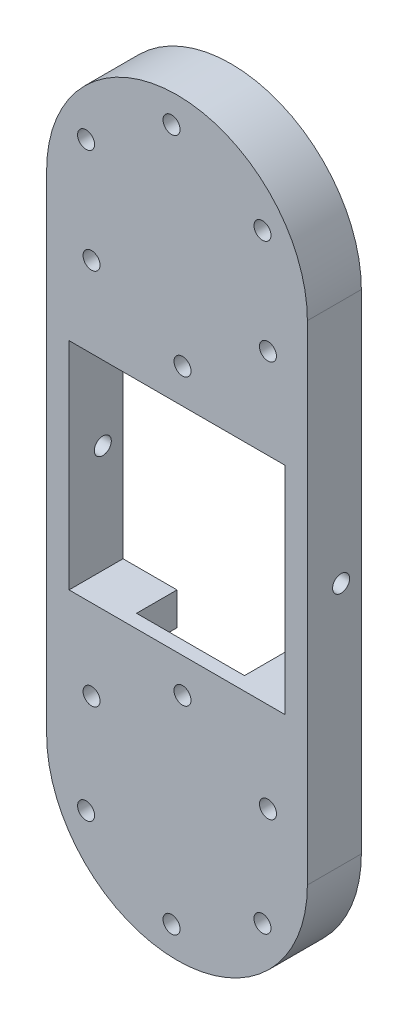
ISO-10303-21;
HEADER;
FILE_DESCRIPTION(('STEP AP214'),'2;1');
FILE_NAME('part.step','',(''),(''),'','','');
FILE_SCHEMA(('AUTOMOTIVE_DESIGN { 1 0 10303 214 1 1 1 1 }'));
ENDSEC;
DATA;
#1=APPLICATION_CONTEXT('core data for automotive mechanical design processes');
#2=APPLICATION_PROTOCOL_DEFINITION('international standard','automotive_design',2000,#1);
#3=PRODUCT_CONTEXT('',#1,'mechanical');
#4=PRODUCT('Part','Part','',(#3));
#5=PRODUCT_RELATED_PRODUCT_CATEGORY('part','',(#4));
#6=PRODUCT_DEFINITION_FORMATION('','',#4);
#7=PRODUCT_DEFINITION_CONTEXT('part definition',#1,'design');
#8=PRODUCT_DEFINITION('design','',#6,#7);
#9=PRODUCT_DEFINITION_SHAPE('','',#8);
#10=(LENGTH_UNIT() NAMED_UNIT(*) SI_UNIT(.MILLI.,.METRE.));
#11=(NAMED_UNIT(*) PLANE_ANGLE_UNIT() SI_UNIT($,.RADIAN.));
#12=(NAMED_UNIT(*) SI_UNIT($,.STERADIAN.) SOLID_ANGLE_UNIT());
#13=UNCERTAINTY_MEASURE_WITH_UNIT(LENGTH_MEASURE(1.E-05),#10,'distance_accuracy_value','');
#14=(GEOMETRIC_REPRESENTATION_CONTEXT(3) GLOBAL_UNCERTAINTY_ASSIGNED_CONTEXT((#13)) GLOBAL_UNIT_ASSIGNED_CONTEXT((#10,
#11,#12)) REPRESENTATION_CONTEXT('',''));
#15=CARTESIAN_POINT('',(0.,0.,0.));
#16=DIRECTION('',(0.,0.,1.));
#17=DIRECTION('',(1.,0.,0.));
#18=AXIS2_PLACEMENT_3D('',#15,#16,#17);
#19=CARTESIAN_POINT('',(0.,57.5,12.7));
#20=DIRECTION('',(0.,0.,-1.));
#21=DIRECTION('',(-1.,0.,0.));
#22=AXIS2_PLACEMENT_3D('',#19,#20,#21);
#23=CYLINDRICAL_SURFACE('',#22,27.5);
#24=DIRECTION('',(0.,0.,-1.));
#25=VECTOR('',#24,1.);
#26=CARTESIAN_POINT('',(12.7,33.1081980985414,12.7));
#27=LINE('',#26,#25);
#28=CARTESIAN_POINT('',(12.7,33.1081980985414,9.52500000000001));
#29=VERTEX_POINT('',#28);
#30=CARTESIAN_POINT('',(12.7,33.1081980985414,0.));
#31=VERTEX_POINT('',#30);
#32=EDGE_CURVE('E569',#29,#31,#27,.T.);
#33=ORIENTED_EDGE('',*,*,#32,.F.);
#34=CARTESIAN_POINT('',(0.,57.5,9.525));
#35=DIRECTION('',(0.,0.,1.));
#36=DIRECTION('',(1.,0.,0.));
#37=AXIS2_PLACEMENT_3D('',#34,#35,#36);
#38=CIRCLE('',#37,27.5);
#39=CARTESIAN_POINT('',(-12.7,33.1081980985414,9.52500000000001));
#40=VERTEX_POINT('',#39);
#41=EDGE_CURVE('E185',#29,#40,#38,.T.);
#42=ORIENTED_EDGE('',*,*,#41,.T.);
#43=DIRECTION('',(0.,0.,-1.));
#44=VECTOR('',#43,1.);
#45=CARTESIAN_POINT('',(-12.7,33.1081980985414,12.7));
#46=LINE('',#45,#44);
#47=CARTESIAN_POINT('',(-12.7,33.1081980985414,0.));
#48=VERTEX_POINT('',#47);
#49=EDGE_CURVE('E177',#48,#40,#46,.F.);
#50=ORIENTED_EDGE('',*,*,#49,.F.);
#51=CARTESIAN_POINT('',(0.,57.5,0.));
#52=DIRECTION('',(0.,0.,1.));
#53=DIRECTION('',(-1.,0.,0.));
#54=AXIS2_PLACEMENT_3D('',#51,#52,#53);
#55=CIRCLE('',#54,27.5);
#56=EDGE_CURVE('E244',#31,#48,#55,.T.);
#57=ORIENTED_EDGE('',*,*,#56,.F.);
#58=EDGE_LOOP('',(#33,#42,#50,#57));
#59=FACE_BOUND('',#58,.T.);
#60=ADVANCED_FACE('F45',(#59),#23,.F.);
#61=CARTESIAN_POINT('',(0.,-57.5,12.7));
#62=DIRECTION('',(0.,0.,-1.));
#63=DIRECTION('',(-1.,0.,0.));
#64=AXIS2_PLACEMENT_3D('',#61,#62,#63);
#65=CYLINDRICAL_SURFACE('',#64,27.5);
#66=DIRECTION('',(0.,0.,-1.));
#67=VECTOR('',#66,1.);
#68=CARTESIAN_POINT('',(12.7,-33.1081980985414,12.7));
#69=LINE('',#68,#67);
#70=CARTESIAN_POINT('',(12.7,-33.1081980985414,0.));
#71=VERTEX_POINT('',#70);
#72=CARTESIAN_POINT('',(12.7,-33.1081980985414,9.52500000000001));
#73=VERTEX_POINT('',#72);
#74=EDGE_CURVE('E564',#71,#73,#69,.F.);
#75=ORIENTED_EDGE('',*,*,#74,.F.);
#76=CARTESIAN_POINT('',(0.,-57.5,0.));
#77=DIRECTION('',(0.,0.,1.));
#78=DIRECTION('',(1.,0.,0.));
#79=AXIS2_PLACEMENT_3D('',#76,#77,#78);
#80=CIRCLE('',#79,27.5);
#81=CARTESIAN_POINT('',(-12.7,-33.1081980985414,0.));
#82=VERTEX_POINT('',#81);
#83=EDGE_CURVE('E175',#82,#71,#80,.T.);
#84=ORIENTED_EDGE('',*,*,#83,.F.);
#85=DIRECTION('',(0.,0.,-1.));
#86=VECTOR('',#85,1.);
#87=CARTESIAN_POINT('',(-12.7,-33.1081980985414,12.7));
#88=LINE('',#87,#86);
#89=CARTESIAN_POINT('',(-12.7,-33.1081980985414,9.52500000000001));
#90=VERTEX_POINT('',#89);
#91=EDGE_CURVE('E160',#90,#82,#88,.T.);
#92=ORIENTED_EDGE('',*,*,#91,.F.);
#93=CARTESIAN_POINT('',(0.,-57.5,9.525));
#94=DIRECTION('',(0.,0.,1.));
#95=DIRECTION('',(1.,0.,0.));
#96=AXIS2_PLACEMENT_3D('',#93,#94,#95);
#97=CIRCLE('',#96,27.5);
#98=EDGE_CURVE('E173',#90,#73,#97,.T.);
#99=ORIENTED_EDGE('',*,*,#98,.T.);
#100=EDGE_LOOP('',(#75,#84,#92,#99));
#101=FACE_BOUND('',#100,.T.);
#102=ADVANCED_FACE('F172',(#101),#65,.F.);
#103=CARTESIAN_POINT('',(0.,-57.5,12.7));
#104=DIRECTION('',(0.,0.,-1.));
#105=DIRECTION('',(-1.,0.,0.));
#106=AXIS2_PLACEMENT_3D('',#103,#104,#105);
#107=PLANE('',#106);
#108=CARTESIAN_POINT('',(0.,-57.5,12.7));
#109=DIRECTION('',(0.,0.,1.));
#110=DIRECTION('',(-1.,0.,0.));
#111=AXIS2_PLACEMENT_3D('',#108,#109,#110);
#112=CIRCLE('',#111,30.6750002325888);
#113=CARTESIAN_POINT('',(-30.6750002325888,-57.5,12.7));
#114=VERTEX_POINT('',#113);
#115=CARTESIAN_POINT('',(30.6750002325889,-57.5,12.7));
#116=VERTEX_POINT('',#115);
#117=EDGE_CURVE('E249',#114,#116,#112,.T.);
#118=ORIENTED_EDGE('',*,*,#117,.T.);
#119=DIRECTION('',(0.,1.,0.));
#120=VECTOR('',#119,1.);
#121=CARTESIAN_POINT('',(30.6750002325889,57.5,12.7));
#122=LINE('',#121,#120);
#123=CARTESIAN_POINT('',(30.6750002325889,57.5,12.7));
#124=VERTEX_POINT('',#123);
#125=EDGE_CURVE('E253',#116,#124,#122,.T.);
#126=ORIENTED_EDGE('',*,*,#125,.T.);
#127=CARTESIAN_POINT('',(0.,57.5,12.7));
#128=DIRECTION('',(0.,0.,1.));
#129=DIRECTION('',(1.,0.,0.));
#130=AXIS2_PLACEMENT_3D('',#127,#128,#129);
#131=CIRCLE('',#130,30.6750002325888);
#132=CARTESIAN_POINT('',(-30.6750002325888,57.5,12.7));
#133=VERTEX_POINT('',#132);
#134=EDGE_CURVE('E257',#124,#133,#131,.T.);
#135=ORIENTED_EDGE('',*,*,#134,.T.);
#136=DIRECTION('',(0.,-1.,0.));
#137=VECTOR('',#136,1.);
#138=CARTESIAN_POINT('',(-30.6750002325888,-57.5,12.7));
#139=LINE('',#138,#137);
#140=EDGE_CURVE('E260',#133,#114,#139,.T.);
#141=ORIENTED_EDGE('',*,*,#140,.T.);
#142=EDGE_LOOP('',(#118,#126,#135,#141));
#143=FACE_BOUND('',#142,.T.);
#144=DIRECTION('',(0.,-1.,0.));
#145=VECTOR('',#144,1.);
#146=CARTESIAN_POINT('',(-25.4,-25.4,12.7));
#147=LINE('',#146,#145);
#148=CARTESIAN_POINT('',(-25.4,25.4,12.7));
#149=VERTEX_POINT('',#148);
#150=CARTESIAN_POINT('',(-25.4,-25.4,12.7));
#151=VERTEX_POINT('',#150);
#152=EDGE_CURVE('E198',#149,#151,#147,.T.);
#153=ORIENTED_EDGE('',*,*,#152,.F.);
#154=DIRECTION('',(-1.,0.,0.));
#155=VECTOR('',#154,1.);
#156=CARTESIAN_POINT('',(25.4,25.4,12.7));
#157=LINE('',#156,#155);
#158=CARTESIAN_POINT('',(25.4,25.4,12.7));
#159=VERTEX_POINT('',#158);
#160=EDGE_CURVE('E209',#159,#149,#157,.T.);
#161=ORIENTED_EDGE('',*,*,#160,.F.);
#162=DIRECTION('',(0.,1.,0.));
#163=VECTOR('',#162,1.);
#164=CARTESIAN_POINT('',(25.4,-25.4,12.7));
#165=LINE('',#164,#163);
#166=CARTESIAN_POINT('',(25.4,-25.4,12.7));
#167=VERTEX_POINT('',#166);
#168=EDGE_CURVE('E205',#167,#159,#165,.T.);
#169=ORIENTED_EDGE('',*,*,#168,.F.);
#170=DIRECTION('',(1.,0.,0.));
#171=VECTOR('',#170,1.);
#172=CARTESIAN_POINT('',(25.4,-25.4,12.7));
#173=LINE('',#172,#171);
#174=EDGE_CURVE('E201',#151,#167,#173,.T.);
#175=ORIENTED_EDGE('',*,*,#174,.F.);
#176=EDGE_LOOP('',(#153,#161,#169,#175));
#177=FACE_BOUND('',#176,.T.);
#178=CARTESIAN_POINT('',(-1.29071679480655,-81.4652675794701,12.7));
#179=DIRECTION('',(0.,0.,1.));
#180=DIRECTION('',(-1.,0.,0.));
#181=AXIS2_PLACEMENT_3D('',#178,#179,#180);
#182=CIRCLE('',#181,2.00000000000005);
#183=CARTESIAN_POINT('',(-3.2907167948066,-81.4652675794701,12.7));
#184=VERTEX_POINT('',#183);
#185=EDGE_CURVE('E593',#184,#184,#182,.T.);
#186=ORIENTED_EDGE('',*,*,#185,.F.);
#187=EDGE_LOOP('',(#186));
#188=FACE_BOUND('',#187,.T.);
#189=CARTESIAN_POINT('',(20.1091721349095,-70.6004273231288,12.7));
#190=DIRECTION('',(0.,0.,1.));
#191=DIRECTION('',(-1.,0.,0.));
#192=AXIS2_PLACEMENT_3D('',#189,#190,#191);
#193=CIRCLE('',#192,2.00000000000003);
#194=CARTESIAN_POINT('',(18.1091721349095,-70.6004273231288,12.7));
#195=VERTEX_POINT('',#194);
#196=EDGE_CURVE('E592',#195,#195,#193,.T.);
#197=ORIENTED_EDGE('',*,*,#196,.F.);
#198=EDGE_LOOP('',(#197));
#199=FACE_BOUND('',#198,.T.);
#200=CARTESIAN_POINT('',(21.3998889297161,-46.6351597436586,12.7));
#201=DIRECTION('',(0.,0.,1.));
#202=DIRECTION('',(-1.,0.,0.));
#203=AXIS2_PLACEMENT_3D('',#200,#201,#202);
#204=CIRCLE('',#203,2.00000000000001);
#205=CARTESIAN_POINT('',(19.3998889297161,-46.6351597436586,12.7));
#206=VERTEX_POINT('',#205);
#207=EDGE_CURVE('E601',#206,#206,#204,.T.);
#208=ORIENTED_EDGE('',*,*,#207,.F.);
#209=EDGE_LOOP('',(#208));
#210=FACE_BOUND('',#209,.T.);
#211=CARTESIAN_POINT('',(1.29071679480657,-33.5347324205298,12.7));
#212=DIRECTION('',(0.,0.,1.));
#213=DIRECTION('',(-1.,0.,0.));
#214=AXIS2_PLACEMENT_3D('',#211,#212,#213);
#215=CIRCLE('',#214,2.00000000000001);
#216=CARTESIAN_POINT('',(-0.709283205193444,-33.5347324205298,12.7));
#217=VERTEX_POINT('',#216);
#218=EDGE_CURVE('E609',#217,#217,#215,.T.);
#219=ORIENTED_EDGE('',*,*,#218,.F.);
#220=EDGE_LOOP('',(#219));
#221=FACE_BOUND('',#220,.T.);
#222=CARTESIAN_POINT('',(-20.1091721349095,-44.3995726768712,12.7));
#223=DIRECTION('',(0.,0.,1.));
#224=DIRECTION('',(-1.,0.,0.));
#225=AXIS2_PLACEMENT_3D('',#222,#223,#224);
#226=CIRCLE('',#225,2.00000000000003);
#227=CARTESIAN_POINT('',(-22.1091721349095,-44.3995726768712,12.7));
#228=VERTEX_POINT('',#227);
#229=EDGE_CURVE('E617',#228,#228,#226,.T.);
#230=ORIENTED_EDGE('',*,*,#229,.F.);
#231=EDGE_LOOP('',(#230));
#232=FACE_BOUND('',#231,.T.);
#233=CARTESIAN_POINT('',(-21.3998889297161,-68.3648402563413,12.7));
#234=DIRECTION('',(0.,0.,1.));
#235=DIRECTION('',(-1.,0.,0.));
#236=AXIS2_PLACEMENT_3D('',#233,#234,#235);
#237=CIRCLE('',#236,2.00000000000005);
#238=CARTESIAN_POINT('',(-23.3998889297161,-68.3648402563413,12.7));
#239=VERTEX_POINT('',#238);
#240=EDGE_CURVE('E665',#239,#239,#237,.T.);
#241=ORIENTED_EDGE('',*,*,#240,.F.);
#242=EDGE_LOOP('',(#241));
#243=FACE_BOUND('',#242,.T.);
#244=CARTESIAN_POINT('',(-1.29071679480655,81.4652675794702,12.7));
#245=DIRECTION('',(0.,0.,1.));
#246=DIRECTION('',(1.,0.,0.));
#247=AXIS2_PLACEMENT_3D('',#244,#245,#246);
#248=CIRCLE('',#247,2.00000000000005);
#249=CARTESIAN_POINT('',(0.709283205193494,81.4652675794702,12.7));
#250=VERTEX_POINT('',#249);
#251=EDGE_CURVE('E194',#250,#250,#248,.T.);
#252=ORIENTED_EDGE('',*,*,#251,.F.);
#253=EDGE_LOOP('',(#252));
#254=FACE_BOUND('',#253,.T.);
#255=CARTESIAN_POINT('',(20.1091721349095,70.6004273231288,12.7));
#256=DIRECTION('',(0.,0.,1.));
#257=DIRECTION('',(1.,0.,0.));
#258=AXIS2_PLACEMENT_3D('',#255,#256,#257);
#259=CIRCLE('',#258,2.00000000000001);
#260=CARTESIAN_POINT('',(22.1091721349095,70.6004273231288,12.7));
#261=VERTEX_POINT('',#260);
#262=EDGE_CURVE('E657',#261,#261,#259,.T.);
#263=ORIENTED_EDGE('',*,*,#262,.F.);
#264=EDGE_LOOP('',(#263));
#265=FACE_BOUND('',#264,.T.);
#266=CARTESIAN_POINT('',(21.3998889297161,46.6351597436586,12.7));
#267=DIRECTION('',(0.,0.,1.));
#268=DIRECTION('',(1.,0.,0.));
#269=AXIS2_PLACEMENT_3D('',#266,#267,#268);
#270=CIRCLE('',#269,2.);
#271=CARTESIAN_POINT('',(23.3998889297161,46.6351597436586,12.7));
#272=VERTEX_POINT('',#271);
#273=EDGE_CURVE('E649',#272,#272,#270,.T.);
#274=ORIENTED_EDGE('',*,*,#273,.F.);
#275=EDGE_LOOP('',(#274));
#276=FACE_BOUND('',#275,.T.);
#277=CARTESIAN_POINT('',(1.29071679480657,33.5347324205298,12.7));
#278=DIRECTION('',(0.,0.,1.));
#279=DIRECTION('',(1.,0.,0.));
#280=AXIS2_PLACEMENT_3D('',#277,#278,#279);
#281=CIRCLE('',#280,2.00000000000003);
#282=CARTESIAN_POINT('',(3.29071679480659,33.5347324205298,12.7));
#283=VERTEX_POINT('',#282);
#284=EDGE_CURVE('E641',#283,#283,#281,.T.);
#285=ORIENTED_EDGE('',*,*,#284,.F.);
#286=EDGE_LOOP('',(#285));
#287=FACE_BOUND('',#286,.T.);
#288=CARTESIAN_POINT('',(-20.1091721349095,44.3995726768712,12.7));
#289=DIRECTION('',(0.,0.,1.));
#290=DIRECTION('',(1.,0.,0.));
#291=AXIS2_PLACEMENT_3D('',#288,#289,#290);
#292=CIRCLE('',#291,2.00000000000003);
#293=CARTESIAN_POINT('',(-18.1091721349094,44.3995726768712,12.7));
#294=VERTEX_POINT('',#293);
#295=EDGE_CURVE('E633',#294,#294,#292,.T.);
#296=ORIENTED_EDGE('',*,*,#295,.F.);
#297=EDGE_LOOP('',(#296));
#298=FACE_BOUND('',#297,.T.);
#299=CARTESIAN_POINT('',(-21.3998889297161,68.3648402563414,12.7));
#300=DIRECTION('',(0.,0.,1.));
#301=DIRECTION('',(1.,0.,0.));
#302=AXIS2_PLACEMENT_3D('',#299,#300,#301);
#303=CIRCLE('',#302,2.00000000000005);
#304=CARTESIAN_POINT('',(-19.399888929716,68.3648402563414,12.7));
#305=VERTEX_POINT('',#304);
#306=EDGE_CURVE('E625',#305,#305,#303,.T.);
#307=ORIENTED_EDGE('',*,*,#306,.F.);
#308=EDGE_LOOP('',(#307));
#309=FACE_BOUND('',#308,.T.);
#310=ADVANCED_FACE('F304',(#143,#177,#188,#199,#210,#221,#232,#243,#254,#265,#276,#287,#298,
#309),#107,.F.);
#311=CARTESIAN_POINT('',(0.,-57.5,0.));
#312=DIRECTION('',(0.,0.,-1.));
#313=DIRECTION('',(-1.,0.,0.));
#314=AXIS2_PLACEMENT_3D('',#311,#312,#313);
#315=PLANE('',#314);
#316=DIRECTION('',(0.,-1.,0.));
#317=VECTOR('',#316,1.);
#318=CARTESIAN_POINT('',(12.7,-37.5,0.));
#319=LINE('',#318,#317);
#320=CARTESIAN_POINT('',(12.7,25.4,0.));
#321=VERTEX_POINT('',#320);
#322=EDGE_CURVE('E726',#31,#321,#319,.T.);
#323=ORIENTED_EDGE('',*,*,#322,.F.);
#324=ORIENTED_EDGE('',*,*,#56,.T.);
#325=DIRECTION('',(0.,1.,0.));
#326=VECTOR('',#325,1.);
#327=CARTESIAN_POINT('',(-12.7,-37.5,0.));
#328=LINE('',#327,#326);
#329=CARTESIAN_POINT('',(-12.7,25.4,0.));
#330=VERTEX_POINT('',#329);
#331=EDGE_CURVE('E712',#330,#48,#328,.T.);
#332=ORIENTED_EDGE('',*,*,#331,.F.);
#333=DIRECTION('',(-1.,0.,0.));
#334=VECTOR('',#333,1.);
#335=CARTESIAN_POINT('',(25.4,25.4,0.));
#336=LINE('',#335,#334);
#337=CARTESIAN_POINT('',(-25.4,25.4,0.));
#338=VERTEX_POINT('',#337);
#339=EDGE_CURVE('E225',#330,#338,#336,.T.);
#340=ORIENTED_EDGE('',*,*,#339,.T.);
#341=DIRECTION('',(0.,-1.,0.));
#342=VECTOR('',#341,1.);
#343=CARTESIAN_POINT('',(-25.4,-25.4,0.));
#344=LINE('',#343,#342);
#345=CARTESIAN_POINT('',(-25.4,-25.4,0.));
#346=VERTEX_POINT('',#345);
#347=EDGE_CURVE('E191',#338,#346,#344,.T.);
#348=ORIENTED_EDGE('',*,*,#347,.T.);
#349=DIRECTION('',(1.,0.,0.));
#350=VECTOR('',#349,1.);
#351=CARTESIAN_POINT('',(25.4,-25.4,0.));
#352=LINE('',#351,#350);
#353=CARTESIAN_POINT('',(-12.7,-25.4,0.));
#354=VERTEX_POINT('',#353);
#355=EDGE_CURVE('E217',#346,#354,#352,.T.);
#356=ORIENTED_EDGE('',*,*,#355,.T.);
#357=EDGE_CURVE('E62',#82,#354,#328,.T.);
#358=ORIENTED_EDGE('',*,*,#357,.F.);
#359=ORIENTED_EDGE('',*,*,#83,.T.);
#360=CARTESIAN_POINT('',(12.7,-25.4,0.));
#361=VERTEX_POINT('',#360);
#362=EDGE_CURVE('E723',#361,#71,#319,.T.);
#363=ORIENTED_EDGE('',*,*,#362,.F.);
#364=CARTESIAN_POINT('',(25.4,-25.4,0.));
#365=VERTEX_POINT('',#364);
#366=EDGE_CURVE('E216',#361,#365,#352,.T.);
#367=ORIENTED_EDGE('',*,*,#366,.T.);
#368=DIRECTION('',(0.,1.,0.));
#369=VECTOR('',#368,1.);
#370=CARTESIAN_POINT('',(25.4,-25.4,0.));
#371=LINE('',#370,#369);
#372=CARTESIAN_POINT('',(25.4,25.4,0.));
#373=VERTEX_POINT('',#372);
#374=EDGE_CURVE('E221',#365,#373,#371,.T.);
#375=ORIENTED_EDGE('',*,*,#374,.T.);
#376=EDGE_CURVE('E202',#373,#321,#336,.T.);
#377=ORIENTED_EDGE('',*,*,#376,.T.);
#378=EDGE_LOOP('',(#323,#324,#332,#340,#348,#356,#358,#359,#363,#367,#375,#377));
#379=FACE_BOUND('',#378,.T.);
#380=CARTESIAN_POINT('',(0.,-57.5,0.));
#381=DIRECTION('',(0.,0.,1.));
#382=DIRECTION('',(-1.,0.,0.));
#383=AXIS2_PLACEMENT_3D('',#380,#381,#382);
#384=CIRCLE('',#383,30.6750002325888);
#385=CARTESIAN_POINT('',(-30.6750002325888,-57.5,0.));
#386=VERTEX_POINT('',#385);
#387=CARTESIAN_POINT('',(30.6750002325889,-57.5,0.));
#388=VERTEX_POINT('',#387);
#389=EDGE_CURVE('E248',#386,#388,#384,.T.);
#390=ORIENTED_EDGE('',*,*,#389,.F.);
#391=DIRECTION('',(0.,-1.,0.));
#392=VECTOR('',#391,1.);
#393=CARTESIAN_POINT('',(-30.6750002325888,-57.5,0.));
#394=LINE('',#393,#392);
#395=CARTESIAN_POINT('',(-30.6750002325888,57.5,0.));
#396=VERTEX_POINT('',#395);
#397=EDGE_CURVE('E254',#396,#386,#394,.T.);
#398=ORIENTED_EDGE('',*,*,#397,.F.);
#399=CARTESIAN_POINT('',(0.,57.5,0.));
#400=DIRECTION('',(0.,0.,1.));
#401=DIRECTION('',(1.,0.,0.));
#402=AXIS2_PLACEMENT_3D('',#399,#400,#401);
#403=CIRCLE('',#402,30.6750002325888);
#404=CARTESIAN_POINT('',(30.6750002325889,57.5,0.));
#405=VERTEX_POINT('',#404);
#406=EDGE_CURVE('E271',#405,#396,#403,.T.);
#407=ORIENTED_EDGE('',*,*,#406,.F.);
#408=DIRECTION('',(0.,1.,0.));
#409=VECTOR('',#408,1.);
#410=CARTESIAN_POINT('',(30.6750002325889,57.5,0.));
#411=LINE('',#410,#409);
#412=EDGE_CURVE('E267',#388,#405,#411,.T.);
#413=ORIENTED_EDGE('',*,*,#412,.F.);
#414=EDGE_LOOP('',(#390,#398,#407,#413));
#415=FACE_BOUND('',#414,.T.);
#416=ADVANCED_FACE('F297',(#379,#415),#315,.T.);
#417=CARTESIAN_POINT('',(0.,-57.5,12.7));
#418=DIRECTION('',(0.,0.,-1.));
#419=DIRECTION('',(-1.,0.,0.));
#420=AXIS2_PLACEMENT_3D('',#417,#418,#419);
#421=CYLINDRICAL_SURFACE('',#420,30.6750002325888);
#422=DIRECTION('',(0.,0.,-1.));
#423=VECTOR('',#422,1.);
#424=CARTESIAN_POINT('',(-30.6750002325888,-57.5,12.7));
#425=LINE('',#424,#423);
#426=EDGE_CURVE('E263',#114,#386,#425,.T.);
#427=ORIENTED_EDGE('',*,*,#426,.T.);
#428=ORIENTED_EDGE('',*,*,#389,.T.);
#429=DIRECTION('',(0.,0.,-1.));
#430=VECTOR('',#429,1.);
#431=CARTESIAN_POINT('',(30.6750002325889,-57.5,12.7));
#432=LINE('',#431,#430);
#433=EDGE_CURVE('E11',#116,#388,#432,.T.);
#434=ORIENTED_EDGE('',*,*,#433,.F.);
#435=ORIENTED_EDGE('',*,*,#117,.F.);
#436=EDGE_LOOP('',(#427,#428,#434,#435));
#437=FACE_BOUND('',#436,.T.);
#438=ADVANCED_FACE('F47',(#437),#421,.T.);
#439=CARTESIAN_POINT('',(30.6750002325889,57.5,12.7));
#440=DIRECTION('',(-1.,0.,0.));
#441=DIRECTION('',(0.,0.,1.));
#442=AXIS2_PLACEMENT_3D('',#439,#440,#441);
#443=PLANE('',#442);
#444=CARTESIAN_POINT('',(30.6750002325888,0.,4.7625));
#445=DIRECTION('',(-1.,0.,0.));
#446=DIRECTION('',(0.,-1.,0.));
#447=AXIS2_PLACEMENT_3D('',#444,#445,#446);
#448=CIRCLE('',#447,2.);
#449=CARTESIAN_POINT('',(30.6750002325888,-2.,4.7625));
#450=VERTEX_POINT('',#449);
#451=EDGE_CURVE('E580',#450,#450,#448,.T.);
#452=ORIENTED_EDGE('',*,*,#451,.T.);
#453=EDGE_LOOP('',(#452));
#454=FACE_BOUND('',#453,.T.);
#455=ORIENTED_EDGE('',*,*,#433,.T.);
#456=ORIENTED_EDGE('',*,*,#412,.T.);
#457=DIRECTION('',(0.,0.,-1.));
#458=VECTOR('',#457,1.);
#459=CARTESIAN_POINT('',(30.6750002325889,57.5,12.7));
#460=LINE('',#459,#458);
#461=EDGE_CURVE('E55',#124,#405,#460,.T.);
#462=ORIENTED_EDGE('',*,*,#461,.F.);
#463=ORIENTED_EDGE('',*,*,#125,.F.);
#464=EDGE_LOOP('',(#455,#456,#462,#463));
#465=FACE_BOUND('',#464,.T.);
#466=ADVANCED_FACE('F293',(#454,#465),#443,.F.);
#467=CARTESIAN_POINT('',(0.,57.5,12.7));
#468=DIRECTION('',(0.,0.,-1.));
#469=DIRECTION('',(-1.,0.,0.));
#470=AXIS2_PLACEMENT_3D('',#467,#468,#469);
#471=CYLINDRICAL_SURFACE('',#470,30.6750002325888);
#472=ORIENTED_EDGE('',*,*,#461,.T.);
#473=ORIENTED_EDGE('',*,*,#406,.T.);
#474=DIRECTION('',(0.,0.,-1.));
#475=VECTOR('',#474,1.);
#476=CARTESIAN_POINT('',(-30.6750002325888,57.5,12.7));
#477=LINE('',#476,#475);
#478=EDGE_CURVE('E280',#133,#396,#477,.T.);
#479=ORIENTED_EDGE('',*,*,#478,.F.);
#480=ORIENTED_EDGE('',*,*,#134,.F.);
#481=EDGE_LOOP('',(#472,#473,#479,#480));
#482=FACE_BOUND('',#481,.T.);
#483=ADVANCED_FACE('F287',(#482),#471,.T.);
#484=CARTESIAN_POINT('',(-30.6750002325888,-57.5,12.7));
#485=DIRECTION('',(1.,0.,0.));
#486=DIRECTION('',(0.,0.,-1.));
#487=AXIS2_PLACEMENT_3D('',#484,#485,#486);
#488=PLANE('',#487);
#489=CARTESIAN_POINT('',(-30.6750002325888,0.,4.7625));
#490=DIRECTION('',(-1.,0.,0.));
#491=DIRECTION('',(0.,-1.,0.));
#492=AXIS2_PLACEMENT_3D('',#489,#490,#491);
#493=CIRCLE('',#492,2.);
#494=CARTESIAN_POINT('',(-30.6750002325888,-2.,4.7625));
#495=VERTEX_POINT('',#494);
#496=EDGE_CURVE('E584',#495,#495,#493,.T.);
#497=ORIENTED_EDGE('',*,*,#496,.F.);
#498=EDGE_LOOP('',(#497));
#499=FACE_BOUND('',#498,.T.);
#500=ORIENTED_EDGE('',*,*,#478,.T.);
#501=ORIENTED_EDGE('',*,*,#397,.T.);
#502=ORIENTED_EDGE('',*,*,#426,.F.);
#503=ORIENTED_EDGE('',*,*,#140,.F.);
#504=EDGE_LOOP('',(#500,#501,#502,#503));
#505=FACE_BOUND('',#504,.T.);
#506=ADVANCED_FACE('F300',(#499,#505),#488,.F.);
#507=CARTESIAN_POINT('',(-25.4,-25.4,12.7));
#508=DIRECTION('',(1.,0.,0.));
#509=DIRECTION('',(0.,1.,0.));
#510=AXIS2_PLACEMENT_3D('',#507,#508,#509);
#511=PLANE('',#510);
#512=CARTESIAN_POINT('',(-25.4,0.,4.7625));
#513=DIRECTION('',(1.,0.,0.));
#514=DIRECTION('',(0.,1.,0.));
#515=AXIS2_PLACEMENT_3D('',#512,#513,#514);
#516=CIRCLE('',#515,2.);
#517=CARTESIAN_POINT('',(-25.4,2.,4.7625));
#518=VERTEX_POINT('',#517);
#519=EDGE_CURVE('E49',#518,#518,#516,.T.);
#520=ORIENTED_EDGE('',*,*,#519,.F.);
#521=EDGE_LOOP('',(#520));
#522=FACE_BOUND('',#521,.T.);
#523=DIRECTION('',(0.,0.,-1.));
#524=VECTOR('',#523,1.);
#525=CARTESIAN_POINT('',(-25.4,-25.4,12.7));
#526=LINE('',#525,#524);
#527=EDGE_CURVE('E239',#151,#346,#526,.T.);
#528=ORIENTED_EDGE('',*,*,#527,.T.);
#529=ORIENTED_EDGE('',*,*,#347,.F.);
#530=DIRECTION('',(0.,0.,-1.));
#531=VECTOR('',#530,1.);
#532=CARTESIAN_POINT('',(-25.4,25.4,12.7));
#533=LINE('',#532,#531);
#534=EDGE_CURVE('E212',#149,#338,#533,.T.);
#535=ORIENTED_EDGE('',*,*,#534,.F.);
#536=ORIENTED_EDGE('',*,*,#152,.T.);
#537=EDGE_LOOP('',(#528,#529,#535,#536));
#538=FACE_BOUND('',#537,.T.);
#539=ADVANCED_FACE('F331',(#522,#538),#511,.T.);
#540=CARTESIAN_POINT('',(25.4,-25.4,12.7));
#541=DIRECTION('',(0.,1.,0.));
#542=DIRECTION('',(-1.,0.,0.));
#543=AXIS2_PLACEMENT_3D('',#540,#541,#542);
#544=PLANE('',#543);
#545=DIRECTION('',(0.,0.,-1.));
#546=VECTOR('',#545,1.);
#547=CARTESIAN_POINT('',(12.7,-25.4,12.7));
#548=LINE('',#547,#546);
#549=CARTESIAN_POINT('',(12.7,-25.4,9.52500000000001));
#550=VERTEX_POINT('',#549);
#551=EDGE_CURVE('E560',#550,#361,#548,.T.);
#552=ORIENTED_EDGE('',*,*,#551,.F.);
#553=DIRECTION('',(1.,0.,0.));
#554=VECTOR('',#553,1.);
#555=CARTESIAN_POINT('',(25.4,-25.4,9.525));
#556=LINE('',#555,#554);
#557=CARTESIAN_POINT('',(-12.7,-25.4,9.52500000000001));
#558=VERTEX_POINT('',#557);
#559=EDGE_CURVE('E561',#558,#550,#556,.T.);
#560=ORIENTED_EDGE('',*,*,#559,.F.);
#561=DIRECTION('',(0.,0.,1.));
#562=VECTOR('',#561,1.);
#563=CARTESIAN_POINT('',(-12.7,-25.4,12.7));
#564=LINE('',#563,#562);
#565=EDGE_CURVE('E161',#354,#558,#564,.T.);
#566=ORIENTED_EDGE('',*,*,#565,.F.);
#567=ORIENTED_EDGE('',*,*,#355,.F.);
#568=ORIENTED_EDGE('',*,*,#527,.F.);
#569=ORIENTED_EDGE('',*,*,#174,.T.);
#570=DIRECTION('',(0.,0.,-1.));
#571=VECTOR('',#570,1.);
#572=CARTESIAN_POINT('',(25.4,-25.4,12.7));
#573=LINE('',#572,#571);
#574=EDGE_CURVE('E235',#167,#365,#573,.T.);
#575=ORIENTED_EDGE('',*,*,#574,.T.);
#576=ORIENTED_EDGE('',*,*,#366,.F.);
#577=EDGE_LOOP('',(#552,#560,#566,#567,#568,#569,#575,#576));
#578=FACE_BOUND('',#577,.T.);
#579=ADVANCED_FACE('F463',(#578),#544,.T.);
#580=CARTESIAN_POINT('',(25.4,-25.4,12.7));
#581=DIRECTION('',(-1.,0.,0.));
#582=DIRECTION('',(0.,-1.,0.));
#583=AXIS2_PLACEMENT_3D('',#580,#581,#582);
#584=PLANE('',#583);
#585=CARTESIAN_POINT('',(25.4,0.,4.7625));
#586=DIRECTION('',(1.,0.,0.));
#587=DIRECTION('',(0.,1.,0.));
#588=AXIS2_PLACEMENT_3D('',#585,#586,#587);
#589=CIRCLE('',#588,2.);
#590=CARTESIAN_POINT('',(25.4,2.,4.7625));
#591=VERTEX_POINT('',#590);
#592=EDGE_CURVE('E576',#591,#591,#589,.T.);
#593=ORIENTED_EDGE('',*,*,#592,.T.);
#594=EDGE_LOOP('',(#593));
#595=FACE_BOUND('',#594,.T.);
#596=DIRECTION('',(0.,0.,-1.));
#597=VECTOR('',#596,1.);
#598=CARTESIAN_POINT('',(25.4,25.4,12.7));
#599=LINE('',#598,#597);
#600=EDGE_CURVE('E232',#159,#373,#599,.T.);
#601=ORIENTED_EDGE('',*,*,#600,.T.);
#602=ORIENTED_EDGE('',*,*,#374,.F.);
#603=ORIENTED_EDGE('',*,*,#574,.F.);
#604=ORIENTED_EDGE('',*,*,#168,.T.);
#605=EDGE_LOOP('',(#601,#602,#603,#604));
#606=FACE_BOUND('',#605,.T.);
#607=ADVANCED_FACE('F482',(#595,#606),#584,.T.);
#608=CARTESIAN_POINT('',(25.4,25.4,12.7));
#609=DIRECTION('',(0.,-1.,0.));
#610=DIRECTION('',(1.,0.,0.));
#611=AXIS2_PLACEMENT_3D('',#608,#609,#610);
#612=PLANE('',#611);
#613=DIRECTION('',(0.,0.,1.));
#614=VECTOR('',#613,1.);
#615=CARTESIAN_POINT('',(12.7,25.4,12.7));
#616=LINE('',#615,#614);
#617=CARTESIAN_POINT('',(12.7,25.4,9.52500000000001));
#618=VERTEX_POINT('',#617);
#619=EDGE_CURVE('E565',#321,#618,#616,.T.);
#620=ORIENTED_EDGE('',*,*,#619,.F.);
#621=ORIENTED_EDGE('',*,*,#376,.F.);
#622=ORIENTED_EDGE('',*,*,#600,.F.);
#623=ORIENTED_EDGE('',*,*,#160,.T.);
#624=ORIENTED_EDGE('',*,*,#534,.T.);
#625=ORIENTED_EDGE('',*,*,#339,.F.);
#626=DIRECTION('',(0.,0.,-1.));
#627=VECTOR('',#626,1.);
#628=CARTESIAN_POINT('',(-12.7,25.4,12.7));
#629=LINE('',#628,#627);
#630=CARTESIAN_POINT('',(-12.7,25.4,9.52500000000003));
#631=VERTEX_POINT('',#630);
#632=EDGE_CURVE('E741',#631,#330,#629,.T.);
#633=ORIENTED_EDGE('',*,*,#632,.F.);
#634=DIRECTION('',(-1.,0.,0.));
#635=VECTOR('',#634,1.);
#636=CARTESIAN_POINT('',(25.4,25.4,9.525));
#637=LINE('',#636,#635);
#638=EDGE_CURVE('E166',#618,#631,#637,.T.);
#639=ORIENTED_EDGE('',*,*,#638,.F.);
#640=EDGE_LOOP('',(#620,#621,#622,#623,#624,#625,#633,#639));
#641=FACE_BOUND('',#640,.T.);
#642=ADVANCED_FACE('F346',(#641),#612,.T.);
#643=CARTESIAN_POINT('',(-21.3998889297161,-68.3648402563413,9.525));
#644=DIRECTION('',(0.,0.,1.));
#645=DIRECTION('',(1.,0.,0.));
#646=AXIS2_PLACEMENT_3D('',#643,#644,#645);
#647=CYLINDRICAL_SURFACE('',#646,2.00000000000005);
#648=CARTESIAN_POINT('',(-21.3998889297161,-68.3648402563413,9.525));
#649=DIRECTION('',(0.,0.,1.));
#650=DIRECTION('',(-1.,0.,0.));
#651=AXIS2_PLACEMENT_3D('',#648,#649,#650);
#652=CIRCLE('',#651,2.00000000000005);
#653=CARTESIAN_POINT('',(-23.3998889297161,-68.3648402563413,9.525));
#654=VERTEX_POINT('',#653);
#655=EDGE_CURVE('E669',#654,#654,#652,.T.);
#656=ORIENTED_EDGE('',*,*,#655,.F.);
#657=EDGE_LOOP('',(#656));
#658=FACE_BOUND('',#657,.T.);
#659=ORIENTED_EDGE('',*,*,#240,.T.);
#660=EDGE_LOOP('',(#659));
#661=FACE_BOUND('',#660,.T.);
#662=ADVANCED_FACE('F341',(#658,#661),#647,.F.);
#663=CARTESIAN_POINT('',(-20.1091721349095,-44.3995726768712,9.525));
#664=DIRECTION('',(0.,0.,1.));
#665=DIRECTION('',(1.,0.,0.));
#666=AXIS2_PLACEMENT_3D('',#663,#664,#665);
#667=CYLINDRICAL_SURFACE('',#666,2.00000000000003);
#668=CARTESIAN_POINT('',(-20.1091721349095,-44.3995726768712,9.525));
#669=DIRECTION('',(0.,0.,1.));
#670=DIRECTION('',(-1.,0.,0.));
#671=AXIS2_PLACEMENT_3D('',#668,#669,#670);
#672=CIRCLE('',#671,2.00000000000003);
#673=CARTESIAN_POINT('',(-22.1091721349095,-44.3995726768712,9.525));
#674=VERTEX_POINT('',#673);
#675=EDGE_CURVE('E621',#674,#674,#672,.T.);
#676=ORIENTED_EDGE('',*,*,#675,.F.);
#677=EDGE_LOOP('',(#676));
#678=FACE_BOUND('',#677,.T.);
#679=ORIENTED_EDGE('',*,*,#229,.T.);
#680=EDGE_LOOP('',(#679));
#681=FACE_BOUND('',#680,.T.);
#682=ADVANCED_FACE('F345',(#678,#681),#667,.F.);
#683=CARTESIAN_POINT('',(1.29071679480657,-33.5347324205298,9.525));
#684=DIRECTION('',(0.,0.,1.));
#685=DIRECTION('',(1.,0.,0.));
#686=AXIS2_PLACEMENT_3D('',#683,#684,#685);
#687=CYLINDRICAL_SURFACE('',#686,2.00000000000001);
#688=CARTESIAN_POINT('',(1.29071679480657,-33.5347324205298,9.525));
#689=DIRECTION('',(0.,0.,1.));
#690=DIRECTION('',(-1.,0.,0.));
#691=AXIS2_PLACEMENT_3D('',#688,#689,#690);
#692=CIRCLE('',#691,2.00000000000001);
#693=CARTESIAN_POINT('',(-0.709283205193444,-33.5347324205298,9.525));
#694=VERTEX_POINT('',#693);
#695=EDGE_CURVE('E613',#694,#694,#692,.T.);
#696=ORIENTED_EDGE('',*,*,#695,.F.);
#697=EDGE_LOOP('',(#696));
#698=FACE_BOUND('',#697,.T.);
#699=ORIENTED_EDGE('',*,*,#218,.T.);
#700=EDGE_LOOP('',(#699));
#701=FACE_BOUND('',#700,.T.);
#702=ADVANCED_FACE('F356',(#698,#701),#687,.F.);
#703=CARTESIAN_POINT('',(21.3998889297161,-46.6351597436586,9.525));
#704=DIRECTION('',(0.,0.,1.));
#705=DIRECTION('',(1.,0.,0.));
#706=AXIS2_PLACEMENT_3D('',#703,#704,#705);
#707=CYLINDRICAL_SURFACE('',#706,2.00000000000001);
#708=CARTESIAN_POINT('',(21.3998889297161,-46.6351597436586,9.525));
#709=DIRECTION('',(0.,0.,1.));
#710=DIRECTION('',(-1.,0.,0.));
#711=AXIS2_PLACEMENT_3D('',#708,#709,#710);
#712=CIRCLE('',#711,2.00000000000001);
#713=CARTESIAN_POINT('',(19.3998889297161,-46.6351597436586,9.525));
#714=VERTEX_POINT('',#713);
#715=EDGE_CURVE('E605',#714,#714,#712,.T.);
#716=ORIENTED_EDGE('',*,*,#715,.F.);
#717=EDGE_LOOP('',(#716));
#718=FACE_BOUND('',#717,.T.);
#719=ORIENTED_EDGE('',*,*,#207,.T.);
#720=EDGE_LOOP('',(#719));
#721=FACE_BOUND('',#720,.T.);
#722=ADVANCED_FACE('F365',(#718,#721),#707,.F.);
#723=CARTESIAN_POINT('',(20.1091721349095,-70.6004273231288,9.525));
#724=DIRECTION('',(0.,0.,1.));
#725=DIRECTION('',(1.,0.,0.));
#726=AXIS2_PLACEMENT_3D('',#723,#724,#725);
#727=CYLINDRICAL_SURFACE('',#726,2.00000000000003);
#728=CARTESIAN_POINT('',(20.1091721349095,-70.6004273231288,9.525));
#729=DIRECTION('',(0.,0.,1.));
#730=DIRECTION('',(-1.,0.,0.));
#731=AXIS2_PLACEMENT_3D('',#728,#729,#730);
#732=CIRCLE('',#731,2.00000000000003);
#733=CARTESIAN_POINT('',(18.1091721349095,-70.6004273231288,9.525));
#734=VERTEX_POINT('',#733);
#735=EDGE_CURVE('E597',#734,#734,#732,.T.);
#736=ORIENTED_EDGE('',*,*,#735,.F.);
#737=EDGE_LOOP('',(#736));
#738=FACE_BOUND('',#737,.T.);
#739=ORIENTED_EDGE('',*,*,#196,.T.);
#740=EDGE_LOOP('',(#739));
#741=FACE_BOUND('',#740,.T.);
#742=ADVANCED_FACE('F374',(#738,#741),#727,.F.);
#743=CARTESIAN_POINT('',(0.,-57.5,9.525));
#744=DIRECTION('',(0.,0.,1.));
#745=DIRECTION('',(1.,0.,0.));
#746=AXIS2_PLACEMENT_3D('',#743,#744,#745);
#747=PLANE('',#746);
#748=ORIENTED_EDGE('',*,*,#98,.F.);
#749=DIRECTION('',(0.,1.,0.));
#750=VECTOR('',#749,1.);
#751=CARTESIAN_POINT('',(-12.7,-37.5,9.52500000000001));
#752=LINE('',#751,#750);
#753=EDGE_CURVE('E157',#90,#558,#752,.T.);
#754=ORIENTED_EDGE('',*,*,#753,.T.);
#755=ORIENTED_EDGE('',*,*,#559,.T.);
#756=DIRECTION('',(0.,-1.,0.));
#757=VECTOR('',#756,1.);
#758=CARTESIAN_POINT('',(12.7,-37.5,9.52500000000001));
#759=LINE('',#758,#757);
#760=EDGE_CURVE('E183',#550,#73,#759,.T.);
#761=ORIENTED_EDGE('',*,*,#760,.T.);
#762=EDGE_LOOP('',(#748,#754,#755,#761));
#763=FACE_BOUND('',#762,.T.);
#764=CARTESIAN_POINT('',(-1.29071679480655,-81.4652675794701,9.525));
#765=DIRECTION('',(0.,0.,1.));
#766=DIRECTION('',(-1.,0.,0.));
#767=AXIS2_PLACEMENT_3D('',#764,#765,#766);
#768=CIRCLE('',#767,2.00000000000005);
#769=CARTESIAN_POINT('',(-3.2907167948066,-81.4652675794701,9.525));
#770=VERTEX_POINT('',#769);
#771=EDGE_CURVE('E588',#770,#770,#768,.T.);
#772=ORIENTED_EDGE('',*,*,#771,.T.);
#773=EDGE_LOOP('',(#772));
#774=FACE_BOUND('',#773,.T.);
#775=ORIENTED_EDGE('',*,*,#735,.T.);
#776=EDGE_LOOP('',(#775));
#777=FACE_BOUND('',#776,.T.);
#778=ORIENTED_EDGE('',*,*,#715,.T.);
#779=EDGE_LOOP('',(#778));
#780=FACE_BOUND('',#779,.T.);
#781=ORIENTED_EDGE('',*,*,#675,.T.);
#782=EDGE_LOOP('',(#781));
#783=FACE_BOUND('',#782,.T.);
#784=ORIENTED_EDGE('',*,*,#655,.T.);
#785=EDGE_LOOP('',(#784));
#786=FACE_BOUND('',#785,.T.);
#787=ORIENTED_EDGE('',*,*,#695,.T.);
#788=EDGE_LOOP('',(#787));
#789=FACE_BOUND('',#788,.T.);
#790=ADVANCED_FACE('F180',(#763,#774,#777,#780,#783,#786,#789),#747,.F.);
#791=CARTESIAN_POINT('',(-1.29071679480655,-81.4652675794701,9.525));
#792=DIRECTION('',(0.,0.,1.));
#793=DIRECTION('',(1.,0.,0.));
#794=AXIS2_PLACEMENT_3D('',#791,#792,#793);
#795=CYLINDRICAL_SURFACE('',#794,2.00000000000005);
#796=ORIENTED_EDGE('',*,*,#771,.F.);
#797=EDGE_LOOP('',(#796));
#798=FACE_BOUND('',#797,.T.);
#799=ORIENTED_EDGE('',*,*,#185,.T.);
#800=EDGE_LOOP('',(#799));
#801=FACE_BOUND('',#800,.T.);
#802=ADVANCED_FACE('F389',(#798,#801),#795,.F.);
#803=ORIENTED_EDGE('',*,*,#41,.F.);
#804=EDGE_CURVE('E734',#29,#618,#759,.T.);
#805=ORIENTED_EDGE('',*,*,#804,.T.);
#806=ORIENTED_EDGE('',*,*,#638,.T.);
#807=EDGE_CURVE('E70',#631,#40,#752,.T.);
#808=ORIENTED_EDGE('',*,*,#807,.T.);
#809=EDGE_LOOP('',(#803,#805,#806,#808));
#810=FACE_BOUND('',#809,.T.);
#811=CARTESIAN_POINT('',(-1.29071679480655,81.4652675794702,9.525));
#812=DIRECTION('',(0.,0.,1.));
#813=DIRECTION('',(1.,0.,0.));
#814=AXIS2_PLACEMENT_3D('',#811,#812,#813);
#815=CIRCLE('',#814,2.00000000000005);
#816=CARTESIAN_POINT('',(0.709283205193494,81.4652675794702,9.525));
#817=VERTEX_POINT('',#816);
#818=EDGE_CURVE('E186',#817,#817,#815,.T.);
#819=ORIENTED_EDGE('',*,*,#818,.T.);
#820=EDGE_LOOP('',(#819));
#821=FACE_BOUND('',#820,.T.);
#822=CARTESIAN_POINT('',(20.1091721349095,70.6004273231288,9.525));
#823=DIRECTION('',(0.,0.,1.));
#824=DIRECTION('',(1.,0.,0.));
#825=AXIS2_PLACEMENT_3D('',#822,#823,#824);
#826=CIRCLE('',#825,2.00000000000001);
#827=CARTESIAN_POINT('',(22.1091721349095,70.6004273231288,9.525));
#828=VERTEX_POINT('',#827);
#829=EDGE_CURVE('E661',#828,#828,#826,.T.);
#830=ORIENTED_EDGE('',*,*,#829,.T.);
#831=EDGE_LOOP('',(#830));
#832=FACE_BOUND('',#831,.T.);
#833=CARTESIAN_POINT('',(21.3998889297161,46.6351597436586,9.525));
#834=DIRECTION('',(0.,0.,1.));
#835=DIRECTION('',(1.,0.,0.));
#836=AXIS2_PLACEMENT_3D('',#833,#834,#835);
#837=CIRCLE('',#836,2.);
#838=CARTESIAN_POINT('',(23.3998889297161,46.6351597436586,9.525));
#839=VERTEX_POINT('',#838);
#840=EDGE_CURVE('E653',#839,#839,#837,.T.);
#841=ORIENTED_EDGE('',*,*,#840,.T.);
#842=EDGE_LOOP('',(#841));
#843=FACE_BOUND('',#842,.T.);
#844=CARTESIAN_POINT('',(-20.1091721349095,44.3995726768712,9.525));
#845=DIRECTION('',(0.,0.,1.));
#846=DIRECTION('',(1.,0.,0.));
#847=AXIS2_PLACEMENT_3D('',#844,#845,#846);
#848=CIRCLE('',#847,2.00000000000003);
#849=CARTESIAN_POINT('',(-18.1091721349094,44.3995726768712,9.525));
#850=VERTEX_POINT('',#849);
#851=EDGE_CURVE('E637',#850,#850,#848,.T.);
#852=ORIENTED_EDGE('',*,*,#851,.T.);
#853=EDGE_LOOP('',(#852));
#854=FACE_BOUND('',#853,.T.);
#855=CARTESIAN_POINT('',(-21.3998889297161,68.3648402563414,9.525));
#856=DIRECTION('',(0.,0.,1.));
#857=DIRECTION('',(1.,0.,0.));
#858=AXIS2_PLACEMENT_3D('',#855,#856,#857);
#859=CIRCLE('',#858,2.00000000000005);
#860=CARTESIAN_POINT('',(-19.399888929716,68.3648402563414,9.525));
#861=VERTEX_POINT('',#860);
#862=EDGE_CURVE('E629',#861,#861,#859,.T.);
#863=ORIENTED_EDGE('',*,*,#862,.T.);
#864=EDGE_LOOP('',(#863));
#865=FACE_BOUND('',#864,.T.);
#866=CARTESIAN_POINT('',(1.29071679480657,33.5347324205298,9.525));
#867=DIRECTION('',(0.,0.,1.));
#868=DIRECTION('',(1.,0.,0.));
#869=AXIS2_PLACEMENT_3D('',#866,#867,#868);
#870=CIRCLE('',#869,2.00000000000003);
#871=CARTESIAN_POINT('',(3.29071679480659,33.5347324205298,9.525));
#872=VERTEX_POINT('',#871);
#873=EDGE_CURVE('E645',#872,#872,#870,.T.);
#874=ORIENTED_EDGE('',*,*,#873,.T.);
#875=EDGE_LOOP('',(#874));
#876=FACE_BOUND('',#875,.T.);
#877=ADVANCED_FACE('F393',(#810,#821,#832,#843,#854,#865,#876),#747,.F.);
#878=CARTESIAN_POINT('',(-1.29071679480655,81.4652675794702,9.525));
#879=DIRECTION('',(0.,0.,1.));
#880=DIRECTION('',(1.,0.,0.));
#881=AXIS2_PLACEMENT_3D('',#878,#879,#880);
#882=CYLINDRICAL_SURFACE('',#881,2.00000000000005);
#883=ORIENTED_EDGE('',*,*,#818,.F.);
#884=EDGE_LOOP('',(#883));
#885=FACE_BOUND('',#884,.T.);
#886=ORIENTED_EDGE('',*,*,#251,.T.);
#887=EDGE_LOOP('',(#886));
#888=FACE_BOUND('',#887,.T.);
#889=ADVANCED_FACE('F400',(#885,#888),#882,.F.);
#890=CARTESIAN_POINT('',(20.1091721349095,70.6004273231288,9.525));
#891=DIRECTION('',(0.,0.,1.));
#892=DIRECTION('',(1.,0.,0.));
#893=AXIS2_PLACEMENT_3D('',#890,#891,#892);
#894=CYLINDRICAL_SURFACE('',#893,2.00000000000001);
#895=ORIENTED_EDGE('',*,*,#829,.F.);
#896=EDGE_LOOP('',(#895));
#897=FACE_BOUND('',#896,.T.);
#898=ORIENTED_EDGE('',*,*,#262,.T.);
#899=EDGE_LOOP('',(#898));
#900=FACE_BOUND('',#899,.T.);
#901=ADVANCED_FACE('F404',(#897,#900),#894,.F.);
#902=CARTESIAN_POINT('',(21.3998889297161,46.6351597436586,9.525));
#903=DIRECTION('',(0.,0.,1.));
#904=DIRECTION('',(1.,0.,0.));
#905=AXIS2_PLACEMENT_3D('',#902,#903,#904);
#906=CYLINDRICAL_SURFACE('',#905,2.);
#907=ORIENTED_EDGE('',*,*,#840,.F.);
#908=EDGE_LOOP('',(#907));
#909=FACE_BOUND('',#908,.T.);
#910=ORIENTED_EDGE('',*,*,#273,.T.);
#911=EDGE_LOOP('',(#910));
#912=FACE_BOUND('',#911,.T.);
#913=ADVANCED_FACE('F413',(#909,#912),#906,.F.);
#914=CARTESIAN_POINT('',(1.29071679480657,33.5347324205298,9.525));
#915=DIRECTION('',(0.,0.,1.));
#916=DIRECTION('',(1.,0.,0.));
#917=AXIS2_PLACEMENT_3D('',#914,#915,#916);
#918=CYLINDRICAL_SURFACE('',#917,2.00000000000003);
#919=ORIENTED_EDGE('',*,*,#873,.F.);
#920=EDGE_LOOP('',(#919));
#921=FACE_BOUND('',#920,.T.);
#922=ORIENTED_EDGE('',*,*,#284,.T.);
#923=EDGE_LOOP('',(#922));
#924=FACE_BOUND('',#923,.T.);
#925=ADVANCED_FACE('F422',(#921,#924),#918,.F.);
#926=CARTESIAN_POINT('',(-20.1091721349095,44.3995726768712,9.525));
#927=DIRECTION('',(0.,0.,1.));
#928=DIRECTION('',(1.,0.,0.));
#929=AXIS2_PLACEMENT_3D('',#926,#927,#928);
#930=CYLINDRICAL_SURFACE('',#929,2.00000000000003);
#931=ORIENTED_EDGE('',*,*,#851,.F.);
#932=EDGE_LOOP('',(#931));
#933=FACE_BOUND('',#932,.T.);
#934=ORIENTED_EDGE('',*,*,#295,.T.);
#935=EDGE_LOOP('',(#934));
#936=FACE_BOUND('',#935,.T.);
#937=ADVANCED_FACE('F431',(#933,#936),#930,.F.);
#938=CARTESIAN_POINT('',(-21.3998889297161,68.3648402563414,9.525));
#939=DIRECTION('',(0.,0.,1.));
#940=DIRECTION('',(1.,0.,0.));
#941=AXIS2_PLACEMENT_3D('',#938,#939,#940);
#942=CYLINDRICAL_SURFACE('',#941,2.00000000000005);
#943=ORIENTED_EDGE('',*,*,#862,.F.);
#944=EDGE_LOOP('',(#943));
#945=FACE_BOUND('',#944,.T.);
#946=ORIENTED_EDGE('',*,*,#306,.T.);
#947=EDGE_LOOP('',(#946));
#948=FACE_BOUND('',#947,.T.);
#949=ADVANCED_FACE('F440',(#945,#948),#942,.F.);
#950=CARTESIAN_POINT('',(-20.6750002325888,0.,4.7625));
#951=DIRECTION('',(-1.,0.,0.));
#952=DIRECTION('',(0.,-1.,0.));
#953=AXIS2_PLACEMENT_3D('',#950,#951,#952);
#954=CYLINDRICAL_SURFACE('',#953,2.);
#955=ORIENTED_EDGE('',*,*,#519,.T.);
#956=EDGE_LOOP('',(#955));
#957=FACE_BOUND('',#956,.T.);
#958=ORIENTED_EDGE('',*,*,#496,.T.);
#959=EDGE_LOOP('',(#958));
#960=FACE_BOUND('',#959,.T.);
#961=ADVANCED_FACE('F448',(#957,#960),#954,.F.);
#962=CARTESIAN_POINT('',(20.6750002325888,0.,4.7625));
#963=DIRECTION('',(1.,0.,0.));
#964=DIRECTION('',(0.,-1.,0.));
#965=AXIS2_PLACEMENT_3D('',#962,#963,#964);
#966=CYLINDRICAL_SURFACE('',#965,2.);
#967=ORIENTED_EDGE('',*,*,#592,.F.);
#968=EDGE_LOOP('',(#967));
#969=FACE_BOUND('',#968,.T.);
#970=ORIENTED_EDGE('',*,*,#451,.F.);
#971=EDGE_LOOP('',(#970));
#972=FACE_BOUND('',#971,.T.);
#973=ADVANCED_FACE('F470',(#969,#972),#966,.F.);
#974=CARTESIAN_POINT('',(12.7,-37.5,88.7093418865119));
#975=DIRECTION('',(1.,0.,0.));
#976=DIRECTION('',(0.,0.,-1.));
#977=AXIS2_PLACEMENT_3D('',#974,#975,#976);
#978=PLANE('',#977);
#979=ORIENTED_EDGE('',*,*,#32,.T.);
#980=ORIENTED_EDGE('',*,*,#322,.T.);
#981=ORIENTED_EDGE('',*,*,#619,.T.);
#982=ORIENTED_EDGE('',*,*,#804,.F.);
#983=EDGE_LOOP('',(#979,#980,#981,#982));
#984=FACE_BOUND('',#983,.T.);
#985=ADVANCED_FACE('F492',(#984),#978,.F.);
#986=CARTESIAN_POINT('',(-12.7,-37.5,88.7093418865119));
#987=DIRECTION('',(-1.,0.,0.));
#988=DIRECTION('',(0.,0.,1.));
#989=AXIS2_PLACEMENT_3D('',#986,#987,#988);
#990=PLANE('',#989);
#991=ORIENTED_EDGE('',*,*,#49,.T.);
#992=ORIENTED_EDGE('',*,*,#807,.F.);
#993=ORIENTED_EDGE('',*,*,#632,.T.);
#994=ORIENTED_EDGE('',*,*,#331,.T.);
#995=EDGE_LOOP('',(#991,#992,#993,#994));
#996=FACE_BOUND('',#995,.T.);
#997=ADVANCED_FACE('F524',(#996),#990,.F.);
#998=ORIENTED_EDGE('',*,*,#74,.T.);
#999=ORIENTED_EDGE('',*,*,#760,.F.);
#1000=ORIENTED_EDGE('',*,*,#551,.T.);
#1001=ORIENTED_EDGE('',*,*,#362,.T.);
#1002=EDGE_LOOP('',(#998,#999,#1000,#1001));
#1003=FACE_BOUND('',#1002,.T.);
#1004=ADVANCED_FACE('F527',(#1003),#978,.F.);
#1005=ORIENTED_EDGE('',*,*,#91,.T.);
#1006=ORIENTED_EDGE('',*,*,#357,.T.);
#1007=ORIENTED_EDGE('',*,*,#565,.T.);
#1008=ORIENTED_EDGE('',*,*,#753,.F.);
#1009=EDGE_LOOP('',(#1005,#1006,#1007,#1008));
#1010=FACE_BOUND('',#1009,.T.);
#1011=ADVANCED_FACE('F159',(#1010),#990,.F.);
#1012=CLOSED_SHELL('',(#60,#102,#310,#416,#438,#466,#483,#506,#539,#579,#607,#642,#662,#682,
#702,#722,#742,#790,#802,#877,#889,#901,#913,#925,#937,#949,#961,#973,#985,#997,#1004,#1011));
#1013=MANIFOLD_SOLID_BREP('B2',#1012);
#1014=ADVANCED_BREP_SHAPE_REPRESENTATION('',(#18,#1013),#14);
#1015=SHAPE_DEFINITION_REPRESENTATION(#9,#1014);
ENDSEC;
END-ISO-10303-21;
